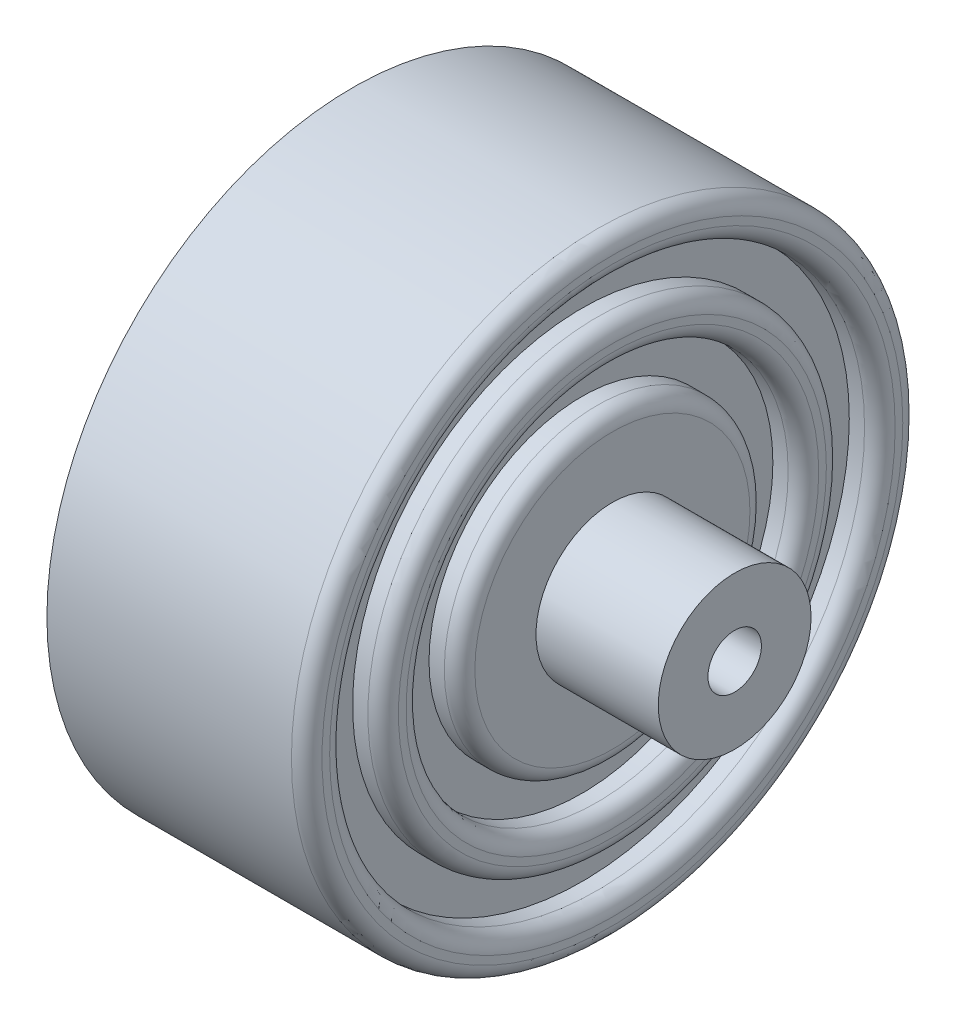
ISO-10303-21;
HEADER;
FILE_DESCRIPTION(('STEP AP214'),'2;1');
FILE_NAME('part.step','',(''),(''),'','','');
FILE_SCHEMA(('AUTOMOTIVE_DESIGN { 1 0 10303 214 1 1 1 1 }'));
ENDSEC;
DATA;
#1=APPLICATION_CONTEXT('core data for automotive mechanical design processes');
#2=APPLICATION_PROTOCOL_DEFINITION('international standard','automotive_design',2000,#1);
#3=PRODUCT_CONTEXT('',#1,'mechanical');
#4=PRODUCT('Part','Part','',(#3));
#5=PRODUCT_RELATED_PRODUCT_CATEGORY('part','',(#4));
#6=PRODUCT_DEFINITION_FORMATION('','',#4);
#7=PRODUCT_DEFINITION_CONTEXT('part definition',#1,'design');
#8=PRODUCT_DEFINITION('design','',#6,#7);
#9=PRODUCT_DEFINITION_SHAPE('','',#8);
#10=(LENGTH_UNIT() NAMED_UNIT(*) SI_UNIT(.MILLI.,.METRE.));
#11=(NAMED_UNIT(*) PLANE_ANGLE_UNIT() SI_UNIT($,.RADIAN.));
#12=(NAMED_UNIT(*) SI_UNIT($,.STERADIAN.) SOLID_ANGLE_UNIT());
#13=UNCERTAINTY_MEASURE_WITH_UNIT(LENGTH_MEASURE(1.E-05),#10,'distance_accuracy_value','');
#14=(GEOMETRIC_REPRESENTATION_CONTEXT(3) GLOBAL_UNCERTAINTY_ASSIGNED_CONTEXT((#13)) GLOBAL_UNIT_ASSIGNED_CONTEXT((#10,
#11,#12)) REPRESENTATION_CONTEXT('',''));
#15=CARTESIAN_POINT('',(0.,0.,0.));
#16=DIRECTION('',(0.,0.,1.));
#17=DIRECTION('',(1.,0.,0.));
#18=AXIS2_PLACEMENT_3D('',#15,#16,#17);
#19=CARTESIAN_POINT('',(17.,0.,0.));
#20=DIRECTION('',(1.,0.,0.));
#21=DIRECTION('',(0.,0.,-1.));
#22=AXIS2_PLACEMENT_3D('',#19,#20,#21);
#23=CYLINDRICAL_SURFACE('',#22,5.);
#24=CARTESIAN_POINT('',(17.,0.,0.));
#25=DIRECTION('',(1.,0.,0.));
#26=DIRECTION('',(0.,0.,-1.));
#27=AXIS2_PLACEMENT_3D('',#24,#25,#26);
#28=CIRCLE('',#27,5.);
#29=CARTESIAN_POINT('',(17.,0.,-5.));
#30=VERTEX_POINT('',#29);
#31=EDGE_CURVE('E263',#30,#30,#28,.T.);
#32=ORIENTED_EDGE('',*,*,#31,.T.);
#33=EDGE_LOOP('',(#32));
#34=FACE_BOUND('',#33,.T.);
#35=CARTESIAN_POINT('',(25.,0.,0.));
#36=DIRECTION('',(1.,0.,0.));
#37=DIRECTION('',(0.,0.,-1.));
#38=AXIS2_PLACEMENT_3D('',#35,#36,#37);
#39=CIRCLE('',#38,5.);
#40=CARTESIAN_POINT('',(25.,0.,-5.));
#41=VERTEX_POINT('',#40);
#42=EDGE_CURVE('E320',#41,#41,#39,.T.);
#43=ORIENTED_EDGE('',*,*,#42,.F.);
#44=EDGE_LOOP('',(#43));
#45=FACE_BOUND('',#44,.T.);
#46=ADVANCED_FACE('F41',(#34,#45),#23,.T.);
#47=CARTESIAN_POINT('',(11.,0.,0.));
#48=DIRECTION('',(1.,0.,0.));
#49=DIRECTION('',(0.,0.,-1.));
#50=AXIS2_PLACEMENT_3D('',#47,#48,#49);
#51=CYLINDRICAL_SURFACE('',#50,1.75);
#52=CARTESIAN_POINT('',(11.,0.,0.));
#53=DIRECTION('',(1.,0.,0.));
#54=DIRECTION('',(0.,0.,-1.));
#55=AXIS2_PLACEMENT_3D('',#52,#53,#54);
#56=CIRCLE('',#55,1.75);
#57=CARTESIAN_POINT('',(11.,0.,-1.75));
#58=VERTEX_POINT('',#57);
#59=EDGE_CURVE('E235',#58,#58,#56,.T.);
#60=ORIENTED_EDGE('',*,*,#59,.F.);
#61=EDGE_LOOP('',(#60));
#62=FACE_BOUND('',#61,.T.);
#63=CARTESIAN_POINT('',(25.,0.,0.));
#64=DIRECTION('',(1.,0.,0.));
#65=DIRECTION('',(0.,0.,-1.));
#66=AXIS2_PLACEMENT_3D('',#63,#64,#65);
#67=CIRCLE('',#66,1.75);
#68=CARTESIAN_POINT('',(25.,0.,-1.75));
#69=VERTEX_POINT('',#68);
#70=EDGE_CURVE('E45',#69,#69,#67,.F.);
#71=ORIENTED_EDGE('',*,*,#70,.F.);
#72=EDGE_LOOP('',(#71));
#73=FACE_BOUND('',#72,.T.);
#74=ADVANCED_FACE('F302',(#62,#73),#51,.F.);
#75=CARTESIAN_POINT('',(16.,0.,0.));
#76=DIRECTION('',(1.,0.,0.));
#77=DIRECTION('',(0.,0.,-1.));
#78=AXIS2_PLACEMENT_3D('',#75,#76,#77);
#79=TOROIDAL_SURFACE('',#78,9.,1.);
#80=CARTESIAN_POINT('',(16.,0.,0.));
#81=DIRECTION('',(1.,0.,0.));
#82=DIRECTION('',(0.,0.,-1.));
#83=AXIS2_PLACEMENT_3D('',#80,#81,#82);
#84=CIRCLE('',#83,10.);
#85=CARTESIAN_POINT('',(16.,0.,-10.));
#86=VERTEX_POINT('',#85);
#87=EDGE_CURVE('E50',#86,#86,#84,.F.);
#88=ORIENTED_EDGE('',*,*,#87,.F.);
#89=EDGE_LOOP('',(#88));
#90=FACE_BOUND('',#89,.T.);
#91=CARTESIAN_POINT('',(17.,0.,0.));
#92=DIRECTION('',(1.,0.,0.));
#93=DIRECTION('',(0.,0.,-1.));
#94=AXIS2_PLACEMENT_3D('',#91,#92,#93);
#95=CIRCLE('',#94,9.);
#96=CARTESIAN_POINT('',(17.,0.,-9.));
#97=VERTEX_POINT('',#96);
#98=EDGE_CURVE('E12',#97,#97,#95,.T.);
#99=ORIENTED_EDGE('',*,*,#98,.F.);
#100=EDGE_LOOP('',(#99));
#101=FACE_BOUND('',#100,.T.);
#102=ADVANCED_FACE('F43',(#90,#101),#79,.T.);
#103=CARTESIAN_POINT('',(16.,0.,0.));
#104=DIRECTION('',(1.,0.,0.));
#105=DIRECTION('',(0.,0.,-1.));
#106=AXIS2_PLACEMENT_3D('',#103,#104,#105);
#107=TOROIDAL_SURFACE('',#106,13.5,1.);
#108=CARTESIAN_POINT('',(16.,0.,0.));
#109=DIRECTION('',(1.,0.,0.));
#110=DIRECTION('',(0.,0.,-1.));
#111=AXIS2_PLACEMENT_3D('',#108,#109,#110);
#112=CIRCLE('',#111,12.5);
#113=CARTESIAN_POINT('',(16.,0.,-12.5));
#114=VERTEX_POINT('',#113);
#115=EDGE_CURVE('E287',#114,#114,#112,.T.);
#116=ORIENTED_EDGE('',*,*,#115,.F.);
#117=EDGE_LOOP('',(#116));
#118=FACE_BOUND('',#117,.T.);
#119=CARTESIAN_POINT('',(17.,0.,0.));
#120=DIRECTION('',(1.,0.,0.));
#121=DIRECTION('',(0.,0.,-1.));
#122=AXIS2_PLACEMENT_3D('',#119,#120,#121);
#123=CIRCLE('',#122,13.5);
#124=CARTESIAN_POINT('',(17.,0.,-13.5));
#125=VERTEX_POINT('',#124);
#126=EDGE_CURVE('E290',#125,#125,#123,.F.);
#127=ORIENTED_EDGE('',*,*,#126,.F.);
#128=EDGE_LOOP('',(#127));
#129=FACE_BOUND('',#128,.T.);
#130=ADVANCED_FACE('F301',(#118,#129),#107,.T.);
#131=CARTESIAN_POINT('',(16.,0.,0.));
#132=DIRECTION('',(1.,0.,0.));
#133=DIRECTION('',(0.,0.,-1.));
#134=AXIS2_PLACEMENT_3D('',#131,#132,#133);
#135=TOROIDAL_SURFACE('',#134,14.,1.);
#136=CARTESIAN_POINT('',(16.,0.,0.));
#137=DIRECTION('',(1.,0.,0.));
#138=DIRECTION('',(0.,0.,-1.));
#139=AXIS2_PLACEMENT_3D('',#136,#137,#138);
#140=CIRCLE('',#139,15.);
#141=CARTESIAN_POINT('',(16.,0.,-15.));
#142=VERTEX_POINT('',#141);
#143=EDGE_CURVE('E281',#142,#142,#140,.F.);
#144=ORIENTED_EDGE('',*,*,#143,.F.);
#145=EDGE_LOOP('',(#144));
#146=FACE_BOUND('',#145,.T.);
#147=CARTESIAN_POINT('',(17.,0.,0.));
#148=DIRECTION('',(1.,0.,0.));
#149=DIRECTION('',(0.,0.,-1.));
#150=AXIS2_PLACEMENT_3D('',#147,#148,#149);
#151=CIRCLE('',#150,14.);
#152=CARTESIAN_POINT('',(17.,0.,-14.));
#153=VERTEX_POINT('',#152);
#154=EDGE_CURVE('E284',#153,#153,#151,.T.);
#155=ORIENTED_EDGE('',*,*,#154,.F.);
#156=EDGE_LOOP('',(#155));
#157=FACE_BOUND('',#156,.T.);
#158=ADVANCED_FACE('F417',(#146,#157),#135,.T.);
#159=CARTESIAN_POINT('',(16.,0.,0.));
#160=DIRECTION('',(1.,0.,0.));
#161=DIRECTION('',(0.,0.,-1.));
#162=AXIS2_PLACEMENT_3D('',#159,#160,#161);
#163=TOROIDAL_SURFACE('',#162,19.,1.);
#164=CARTESIAN_POINT('',(16.,0.,0.));
#165=DIRECTION('',(1.,0.,0.));
#166=DIRECTION('',(0.,0.,-1.));
#167=AXIS2_PLACEMENT_3D('',#164,#165,#166);
#168=CIRCLE('',#167,20.);
#169=CARTESIAN_POINT('',(16.,0.,20.));
#170=VERTEX_POINT('',#169);
#171=EDGE_CURVE('E275',#170,#170,#168,.F.);
#172=ORIENTED_EDGE('',*,*,#171,.F.);
#173=EDGE_LOOP('',(#172));
#174=FACE_BOUND('',#173,.T.);
#175=CARTESIAN_POINT('',(17.,0.,0.));
#176=DIRECTION('',(1.,0.,0.));
#177=DIRECTION('',(0.,0.,-1.));
#178=AXIS2_PLACEMENT_3D('',#175,#176,#177);
#179=CIRCLE('',#178,19.);
#180=CARTESIAN_POINT('',(17.,0.,-19.));
#181=VERTEX_POINT('',#180);
#182=EDGE_CURVE('E278',#181,#181,#179,.T.);
#183=ORIENTED_EDGE('',*,*,#182,.F.);
#184=EDGE_LOOP('',(#183));
#185=FACE_BOUND('',#184,.T.);
#186=ADVANCED_FACE('F413',(#174,#185),#163,.T.);
#187=CARTESIAN_POINT('',(16.,0.,0.));
#188=DIRECTION('',(1.,0.,0.));
#189=DIRECTION('',(0.,0.,-1.));
#190=AXIS2_PLACEMENT_3D('',#187,#188,#189);
#191=TOROIDAL_SURFACE('',#190,18.5,1.);
#192=CARTESIAN_POINT('',(16.,0.,0.));
#193=DIRECTION('',(1.,0.,0.));
#194=DIRECTION('',(0.,0.,-1.));
#195=AXIS2_PLACEMENT_3D('',#192,#193,#194);
#196=CIRCLE('',#195,17.5);
#197=CARTESIAN_POINT('',(16.,0.,-17.5));
#198=VERTEX_POINT('',#197);
#199=EDGE_CURVE('E269',#198,#198,#196,.T.);
#200=ORIENTED_EDGE('',*,*,#199,.F.);
#201=EDGE_LOOP('',(#200));
#202=FACE_BOUND('',#201,.T.);
#203=CARTESIAN_POINT('',(17.,0.,0.));
#204=DIRECTION('',(1.,0.,0.));
#205=DIRECTION('',(0.,0.,-1.));
#206=AXIS2_PLACEMENT_3D('',#203,#204,#205);
#207=CIRCLE('',#206,18.5);
#208=CARTESIAN_POINT('',(17.,0.,-18.5));
#209=VERTEX_POINT('',#208);
#210=EDGE_CURVE('E272',#209,#209,#207,.F.);
#211=ORIENTED_EDGE('',*,*,#210,.F.);
#212=EDGE_LOOP('',(#211));
#213=FACE_BOUND('',#212,.T.);
#214=ADVANCED_FACE('F309',(#202,#213),#191,.T.);
#215=CARTESIAN_POINT('',(17.,0.,0.));
#216=DIRECTION('',(1.,0.,0.));
#217=DIRECTION('',(0.,0.,-1.));
#218=AXIS2_PLACEMENT_3D('',#215,#216,#217);
#219=PLANE('',#218);
#220=ORIENTED_EDGE('',*,*,#98,.T.);
#221=EDGE_LOOP('',(#220));
#222=FACE_BOUND('',#221,.T.);
#223=ORIENTED_EDGE('',*,*,#31,.F.);
#224=EDGE_LOOP('',(#223));
#225=FACE_BOUND('',#224,.T.);
#226=ADVANCED_FACE('F305',(#222,#225),#219,.T.);
#227=CARTESIAN_POINT('',(26.,0.,0.));
#228=DIRECTION('',(-1.,0.,0.));
#229=DIRECTION('',(0.,0.,1.));
#230=AXIS2_PLACEMENT_3D('',#227,#228,#229);
#231=CYLINDRICAL_SURFACE('',#230,20.);
#232=CARTESIAN_POINT('',(0.,0.,0.));
#233=DIRECTION('',(1.,0.,0.));
#234=DIRECTION('',(0.,0.,-1.));
#235=AXIS2_PLACEMENT_3D('',#232,#233,#234);
#236=CIRCLE('',#235,20.);
#237=CARTESIAN_POINT('',(0.,0.,20.));
#238=VERTEX_POINT('',#237);
#239=EDGE_CURVE('E266',#238,#238,#236,.T.);
#240=CARTESIAN_POINT('',(16.,0.,20.));
#241=CARTESIAN_POINT('',(15.8333333333333,0.,20.));
#242=CARTESIAN_POINT('',(15.6666666666667,0.,20.));
#243=CARTESIAN_POINT('',(15.3333333333333,0.,20.));
#244=CARTESIAN_POINT('',(15.1666666666667,0.,20.));
#245=CARTESIAN_POINT('',(14.8333333333333,0.,20.));
#246=CARTESIAN_POINT('',(14.6666666666667,0.,20.));
#247=CARTESIAN_POINT('',(14.3333333333333,0.,20.));
#248=CARTESIAN_POINT('',(14.1666666666667,0.,20.));
#249=CARTESIAN_POINT('',(13.8333333333333,0.,20.));
#250=CARTESIAN_POINT('',(13.6666666666667,0.,20.));
#251=CARTESIAN_POINT('',(13.3333333333333,0.,20.));
#252=CARTESIAN_POINT('',(13.1666666666667,0.,20.));
#253=CARTESIAN_POINT('',(12.8333333333333,0.,20.));
#254=CARTESIAN_POINT('',(12.6666666666667,0.,20.));
#255=CARTESIAN_POINT('',(12.3333333333333,0.,20.));
#256=CARTESIAN_POINT('',(12.1666666666667,0.,20.));
#257=CARTESIAN_POINT('',(11.8333333333333,0.,20.));
#258=CARTESIAN_POINT('',(11.6666666666667,0.,20.));
#259=CARTESIAN_POINT('',(11.3333333333333,0.,20.));
#260=CARTESIAN_POINT('',(11.1666666666667,0.,20.));
#261=CARTESIAN_POINT('',(10.8333333333333,0.,20.));
#262=CARTESIAN_POINT('',(10.6666666666667,0.,20.));
#263=CARTESIAN_POINT('',(10.3333333333333,0.,20.));
#264=CARTESIAN_POINT('',(10.1666666666667,0.,20.));
#265=CARTESIAN_POINT('',(9.83333333333333,0.,20.));
#266=CARTESIAN_POINT('',(9.66666666666667,0.,20.));
#267=CARTESIAN_POINT('',(9.33333333333333,0.,20.));
#268=CARTESIAN_POINT('',(9.16666666666667,0.,20.));
#269=CARTESIAN_POINT('',(8.83333333333333,0.,20.));
#270=CARTESIAN_POINT('',(8.66666666666667,0.,20.));
#271=CARTESIAN_POINT('',(8.33333333333333,0.,20.));
#272=CARTESIAN_POINT('',(8.16666666666667,0.,20.));
#273=CARTESIAN_POINT('',(7.83333333333333,0.,20.));
#274=CARTESIAN_POINT('',(7.66666666666667,0.,20.));
#275=CARTESIAN_POINT('',(7.33333333333333,0.,20.));
#276=CARTESIAN_POINT('',(7.16666666666667,0.,20.));
#277=CARTESIAN_POINT('',(6.83333333333333,0.,20.));
#278=CARTESIAN_POINT('',(6.66666666666667,0.,20.));
#279=CARTESIAN_POINT('',(6.33333333333333,0.,20.));
#280=CARTESIAN_POINT('',(6.16666666666667,0.,20.));
#281=CARTESIAN_POINT('',(5.83333333333333,0.,20.));
#282=CARTESIAN_POINT('',(5.66666666666666,0.,20.));
#283=CARTESIAN_POINT('',(5.33333333333333,0.,20.));
#284=CARTESIAN_POINT('',(5.16666666666667,0.,20.));
#285=CARTESIAN_POINT('',(4.83333333333333,0.,20.));
#286=CARTESIAN_POINT('',(4.66666666666667,0.,20.));
#287=CARTESIAN_POINT('',(4.33333333333333,0.,20.));
#288=CARTESIAN_POINT('',(4.16666666666667,0.,20.));
#289=CARTESIAN_POINT('',(3.83333333333333,0.,20.));
#290=CARTESIAN_POINT('',(3.66666666666667,0.,20.));
#291=CARTESIAN_POINT('',(3.33333333333333,0.,20.));
#292=CARTESIAN_POINT('',(3.16666666666667,0.,20.));
#293=CARTESIAN_POINT('',(2.83333333333333,0.,20.));
#294=CARTESIAN_POINT('',(2.66666666666667,0.,20.));
#295=CARTESIAN_POINT('',(2.33333333333334,0.,20.));
#296=CARTESIAN_POINT('',(2.16666666666667,0.,20.));
#297=CARTESIAN_POINT('',(1.83333333333334,0.,20.));
#298=CARTESIAN_POINT('',(1.66666666666667,0.,20.));
#299=CARTESIAN_POINT('',(1.33333333333333,0.,20.));
#300=CARTESIAN_POINT('',(1.16666666666667,0.,20.));
#301=CARTESIAN_POINT('',(0.833333333333334,0.,20.));
#302=CARTESIAN_POINT('',(0.666666666666667,0.,20.));
#303=CARTESIAN_POINT('',(0.333333333333334,0.,20.));
#304=CARTESIAN_POINT('',(0.166666666666667,0.,20.));
#305=CARTESIAN_POINT('',(0.,0.,20.));
#306=B_SPLINE_CURVE_WITH_KNOTS('',3,(#240,#241,#242,#243,#244,#245,#246,#247,#248,#249,#250,
#251,#252,#253,#254,#255,#256,#257,#258,#259,#260,#261,#262,#263,#264,#265,#266,#267,#268,#269,
#270,#271,#272,#273,#274,#275,#276,#277,#278,#279,#280,#281,#282,#283,#284,#285,#286,#287,#288,
#289,#290,#291,#292,#293,#294,#295,#296,#297,#298,#299,#300,#301,#302,#303,#304,#305),
.UNSPECIFIED.,.F.,.F.,(4,2,2,2,2,2,2,2,2,2,2,2,2,2,2,2,2,2,2,2,2,2,2,2,2,2,2,2,2,2,2,2,4),(0.,
0.500000000000002,1.,1.5,2.,2.5,3.,3.5,4.,4.5,5.,5.5,6.,6.5,7.,7.5,8.,8.5,9.,9.5,10.,10.5,11.,
11.5,12.,12.5,13.,13.5,14.,14.5,15.,15.5,16.),.UNSPECIFIED.);
#307=EDGE_CURVE('BSEAM308',#170,#238,#306,.T.);
#308=ORIENTED_EDGE('',*,*,#171,.T.);
#309=ORIENTED_EDGE('',*,*,#239,.T.);
#310=ORIENTED_EDGE('',*,*,#307,.T.);
#311=ORIENTED_EDGE('',*,*,#307,.F.);
#312=EDGE_LOOP('',(#308,#310,#309,#311));
#313=FACE_BOUND('',#312,.T.);
#314=ADVANCED_FACE('F308',(#313),#231,.T.);
#315=CARTESIAN_POINT('',(0.,0.,0.));
#316=DIRECTION('',(1.,0.,0.));
#317=DIRECTION('',(0.,0.,-1.));
#318=AXIS2_PLACEMENT_3D('',#315,#316,#317);
#319=PLANE('',#318);
#320=DIRECTION('',(0.,-0.366726295490055,0.930328879588364));
#321=VECTOR('',#320,1.);
#322=CARTESIAN_POINT('',(0.,-1.5,-18.));
#323=LINE('',#322,#321);
#324=CARTESIAN_POINT('',(0.,-1.5,-18.));
#325=VERTEX_POINT('',#324);
#326=CARTESIAN_POINT('',(0.,-5.2374013026521,-8.51878087492442));
#327=VERTEX_POINT('',#326);
#328=EDGE_CURVE('E191',#325,#327,#323,.T.);
#329=ORIENTED_EDGE('',*,*,#328,.F.);
#330=CARTESIAN_POINT('',(0.,0.,-18.));
#331=DIRECTION('',(-1.,0.,0.));
#332=DIRECTION('',(0.,0.,1.));
#333=AXIS2_PLACEMENT_3D('',#330,#331,#332);
#334=CIRCLE('',#333,1.5);
#335=CARTESIAN_POINT('',(0.,1.5,-18.));
#336=VERTEX_POINT('',#335);
#337=EDGE_CURVE('E57',#336,#325,#334,.T.);
#338=ORIENTED_EDGE('',*,*,#337,.F.);
#339=DIRECTION('',(0.,-0.366726295490055,-0.930328879588364));
#340=VECTOR('',#339,1.);
#341=CARTESIAN_POINT('',(0.,1.5,-18.));
#342=LINE('',#341,#340);
#343=CARTESIAN_POINT('',(0.,5.23740130265211,-8.51878087492442));
#344=VERTEX_POINT('',#343);
#345=EDGE_CURVE('E231',#344,#336,#342,.T.);
#346=ORIENTED_EDGE('',*,*,#345,.F.);
#347=CARTESIAN_POINT('',(0.,0.,0.));
#348=DIRECTION('',(-1.,0.,0.));
#349=DIRECTION('',(0.,0.,1.));
#350=AXIS2_PLACEMENT_3D('',#347,#348,#349);
#351=CIRCLE('',#350,10.);
#352=CARTESIAN_POINT('',(0.,8.40218228326776,-5.42248401369164));
#353=VERTEX_POINT('',#352);
#354=EDGE_CURVE('E229',#353,#344,#351,.T.);
#355=ORIENTED_EDGE('',*,*,#354,.F.);
#356=DIRECTION('',(0.,-0.925678580015344,-0.378310938912392));
#357=VECTOR('',#356,1.);
#358=CARTESIAN_POINT('',(0.,18.,-1.5));
#359=LINE('',#358,#357);
#360=CARTESIAN_POINT('',(0.,18.,-1.5));
#361=VERTEX_POINT('',#360);
#362=EDGE_CURVE('E165',#361,#353,#359,.T.);
#363=ORIENTED_EDGE('',*,*,#362,.F.);
#364=CARTESIAN_POINT('',(0.,18.,0.));
#365=DIRECTION('',(-1.,0.,0.));
#366=DIRECTION('',(0.,0.,1.));
#367=AXIS2_PLACEMENT_3D('',#364,#365,#366);
#368=CIRCLE('',#367,1.5);
#369=CARTESIAN_POINT('',(0.,18.,1.5));
#370=VERTEX_POINT('',#369);
#371=EDGE_CURVE('E225',#370,#361,#368,.T.);
#372=ORIENTED_EDGE('',*,*,#371,.F.);
#373=DIRECTION('',(0.,0.925678580015344,-0.378310938912392));
#374=VECTOR('',#373,1.);
#375=CARTESIAN_POINT('',(0.,18.,1.5));
#376=LINE('',#375,#374);
#377=CARTESIAN_POINT('',(0.,8.40218228326776,5.42248401369164));
#378=VERTEX_POINT('',#377);
#379=EDGE_CURVE('E222',#378,#370,#376,.T.);
#380=ORIENTED_EDGE('',*,*,#379,.F.);
#381=CARTESIAN_POINT('',(0.,0.,0.));
#382=DIRECTION('',(-1.,0.,0.));
#383=DIRECTION('',(0.,0.,1.));
#384=AXIS2_PLACEMENT_3D('',#381,#382,#383);
#385=CIRCLE('',#384,10.);
#386=CARTESIAN_POINT('',(0.,5.23740130265211,8.51878087492442));
#387=VERTEX_POINT('',#386);
#388=EDGE_CURVE('E219',#387,#378,#385,.T.);
#389=ORIENTED_EDGE('',*,*,#388,.F.);
#390=DIRECTION('',(0.,0.366726295490055,-0.930328879588364));
#391=VECTOR('',#390,1.);
#392=CARTESIAN_POINT('',(0.,1.5,18.));
#393=LINE('',#392,#391);
#394=CARTESIAN_POINT('',(0.,1.5,18.));
#395=VERTEX_POINT('',#394);
#396=EDGE_CURVE('E216',#395,#387,#393,.T.);
#397=ORIENTED_EDGE('',*,*,#396,.F.);
#398=CARTESIAN_POINT('',(0.,0.,18.));
#399=DIRECTION('',(-1.,0.,0.));
#400=DIRECTION('',(0.,0.,1.));
#401=AXIS2_PLACEMENT_3D('',#398,#399,#400);
#402=CIRCLE('',#401,1.5);
#403=CARTESIAN_POINT('',(0.,-1.5,18.));
#404=VERTEX_POINT('',#403);
#405=EDGE_CURVE('E213',#404,#395,#402,.T.);
#406=ORIENTED_EDGE('',*,*,#405,.F.);
#407=DIRECTION('',(0.,0.366726295490055,0.930328879588364));
#408=VECTOR('',#407,1.);
#409=CARTESIAN_POINT('',(0.,-1.5,18.));
#410=LINE('',#409,#408);
#411=CARTESIAN_POINT('',(0.,-5.23740130265211,8.51878087492442));
#412=VERTEX_POINT('',#411);
#413=EDGE_CURVE('E210',#412,#404,#410,.T.);
#414=ORIENTED_EDGE('',*,*,#413,.F.);
#415=CARTESIAN_POINT('',(0.,0.,0.));
#416=DIRECTION('',(-1.,0.,0.));
#417=DIRECTION('',(0.,0.,1.));
#418=AXIS2_PLACEMENT_3D('',#415,#416,#417);
#419=CIRCLE('',#418,10.);
#420=CARTESIAN_POINT('',(0.,-8.40218228326776,5.42248401369164));
#421=VERTEX_POINT('',#420);
#422=EDGE_CURVE('E207',#421,#412,#419,.T.);
#423=ORIENTED_EDGE('',*,*,#422,.F.);
#424=DIRECTION('',(0.,0.925678580015344,0.378310938912392));
#425=VECTOR('',#424,1.);
#426=CARTESIAN_POINT('',(0.,-18.,1.5));
#427=LINE('',#426,#425);
#428=CARTESIAN_POINT('',(0.,-18.,1.5));
#429=VERTEX_POINT('',#428);
#430=EDGE_CURVE('E204',#429,#421,#427,.T.);
#431=ORIENTED_EDGE('',*,*,#430,.F.);
#432=CARTESIAN_POINT('',(0.,-18.,0.));
#433=DIRECTION('',(-1.,0.,0.));
#434=DIRECTION('',(0.,0.,1.));
#435=AXIS2_PLACEMENT_3D('',#432,#433,#434);
#436=CIRCLE('',#435,1.5);
#437=CARTESIAN_POINT('',(0.,-18.,-1.5));
#438=VERTEX_POINT('',#437);
#439=EDGE_CURVE('E201',#438,#429,#436,.T.);
#440=ORIENTED_EDGE('',*,*,#439,.F.);
#441=DIRECTION('',(0.,-0.925678580015344,0.378310938912392));
#442=VECTOR('',#441,1.);
#443=CARTESIAN_POINT('',(0.,-18.,-1.5));
#444=LINE('',#443,#442);
#445=CARTESIAN_POINT('',(0.,-8.40218228326776,-5.42248401369164));
#446=VERTEX_POINT('',#445);
#447=EDGE_CURVE('E198',#446,#438,#444,.T.);
#448=ORIENTED_EDGE('',*,*,#447,.F.);
#449=CARTESIAN_POINT('',(0.,0.,0.));
#450=DIRECTION('',(-1.,0.,0.));
#451=DIRECTION('',(0.,0.,1.));
#452=AXIS2_PLACEMENT_3D('',#449,#450,#451);
#453=CIRCLE('',#452,10.);
#454=EDGE_CURVE('E195',#327,#446,#453,.T.);
#455=ORIENTED_EDGE('',*,*,#454,.F.);
#456=EDGE_LOOP('',(#329,#338,#346,#355,#363,#372,#380,#389,#397,#406,#414,#423,#431,#440,#448,#455));
#457=FACE_BOUND('',#456,.T.);
#458=ORIENTED_EDGE('',*,*,#239,.F.);
#459=EDGE_LOOP('',(#458));
#460=FACE_BOUND('',#459,.T.);
#461=ADVANCED_FACE('F382',(#457,#460),#319,.F.);
#462=ORIENTED_EDGE('',*,*,#182,.T.);
#463=EDGE_LOOP('',(#462));
#464=FACE_BOUND('',#463,.T.);
#465=ORIENTED_EDGE('',*,*,#210,.T.);
#466=EDGE_LOOP('',(#465));
#467=FACE_BOUND('',#466,.T.);
#468=ADVANCED_FACE('F312',(#464,#467),#219,.T.);
#469=CARTESIAN_POINT('',(11.,0.,0.));
#470=DIRECTION('',(1.,0.,0.));
#471=DIRECTION('',(0.,0.,-1.));
#472=AXIS2_PLACEMENT_3D('',#469,#470,#471);
#473=PLANE('',#472);
#474=CARTESIAN_POINT('',(11.,0.,0.));
#475=DIRECTION('',(1.,0.,0.));
#476=DIRECTION('',(0.,0.,-1.));
#477=AXIS2_PLACEMENT_3D('',#474,#475,#476);
#478=CIRCLE('',#477,1.5);
#479=CARTESIAN_POINT('',(11.,0.,-1.5));
#480=VERTEX_POINT('',#479);
#481=EDGE_CURVE('E192',#480,#480,#478,.T.);
#482=ORIENTED_EDGE('',*,*,#481,.F.);
#483=EDGE_LOOP('',(#482));
#484=FACE_BOUND('',#483,.T.);
#485=ORIENTED_EDGE('',*,*,#59,.T.);
#486=EDGE_LOOP('',(#485));
#487=FACE_BOUND('',#486,.T.);
#488=ADVANCED_FACE('F388',(#484,#487),#473,.T.);
#489=CARTESIAN_POINT('',(2.,0.,-18.));
#490=DIRECTION('',(-1.,0.,0.));
#491=DIRECTION('',(0.,0.,1.));
#492=AXIS2_PLACEMENT_3D('',#489,#490,#491);
#493=CYLINDRICAL_SURFACE('',#492,1.5);
#494=ORIENTED_EDGE('',*,*,#337,.T.);
#495=DIRECTION('',(-1.,0.,0.));
#496=VECTOR('',#495,1.);
#497=CARTESIAN_POINT('',(2.,-1.5,-18.));
#498=LINE('',#497,#496);
#499=CARTESIAN_POINT('',(2.,-1.5,-18.));
#500=VERTEX_POINT('',#499);
#501=EDGE_CURVE('E117',#500,#325,#498,.T.);
#502=ORIENTED_EDGE('',*,*,#501,.F.);
#503=CARTESIAN_POINT('',(2.,0.,-18.));
#504=DIRECTION('',(-1.,0.,0.));
#505=DIRECTION('',(0.,0.,1.));
#506=AXIS2_PLACEMENT_3D('',#503,#504,#505);
#507=CIRCLE('',#506,1.5);
#508=CARTESIAN_POINT('',(2.,1.5,-18.));
#509=VERTEX_POINT('',#508);
#510=EDGE_CURVE('E233',#509,#500,#507,.T.);
#511=ORIENTED_EDGE('',*,*,#510,.F.);
#512=DIRECTION('',(-1.,0.,0.));
#513=VECTOR('',#512,1.);
#514=CARTESIAN_POINT('',(2.,1.5,-18.));
#515=LINE('',#514,#513);
#516=EDGE_CURVE('E65',#509,#336,#515,.T.);
#517=ORIENTED_EDGE('',*,*,#516,.T.);
#518=EDGE_LOOP('',(#494,#502,#511,#517));
#519=FACE_BOUND('',#518,.T.);
#520=ADVANCED_FACE('F386',(#519),#493,.F.);
#521=CARTESIAN_POINT('',(2.,1.5,-18.));
#522=DIRECTION('',(0.,0.930328879588364,-0.366726295490055));
#523=DIRECTION('',(0.,0.366726295490055,0.930328879588364));
#524=AXIS2_PLACEMENT_3D('',#521,#522,#523);
#525=PLANE('',#524);
#526=ORIENTED_EDGE('',*,*,#345,.T.);
#527=ORIENTED_EDGE('',*,*,#516,.F.);
#528=DIRECTION('',(0.,-0.366726295490055,-0.930328879588364));
#529=VECTOR('',#528,1.);
#530=CARTESIAN_POINT('',(2.,1.5,-18.));
#531=LINE('',#530,#529);
#532=CARTESIAN_POINT('',(2.,5.23740130265211,-8.51878087492442));
#533=VERTEX_POINT('',#532);
#534=EDGE_CURVE('E177',#533,#509,#531,.T.);
#535=ORIENTED_EDGE('',*,*,#534,.F.);
#536=DIRECTION('',(-1.,0.,0.));
#537=VECTOR('',#536,1.);
#538=CARTESIAN_POINT('',(2.,5.23740130265211,-8.51878087492442));
#539=LINE('',#538,#537);
#540=EDGE_CURVE('E169',#533,#344,#539,.T.);
#541=ORIENTED_EDGE('',*,*,#540,.T.);
#542=EDGE_LOOP('',(#526,#527,#535,#541));
#543=FACE_BOUND('',#542,.T.);
#544=ADVANCED_FACE('F385',(#543),#525,.F.);
#545=CARTESIAN_POINT('',(2.,0.,0.));
#546=DIRECTION('',(-1.,0.,0.));
#547=DIRECTION('',(0.,0.,1.));
#548=AXIS2_PLACEMENT_3D('',#545,#546,#547);
#549=CYLINDRICAL_SURFACE('',#548,10.);
#550=ORIENTED_EDGE('',*,*,#354,.T.);
#551=ORIENTED_EDGE('',*,*,#540,.F.);
#552=CARTESIAN_POINT('',(2.,0.,0.));
#553=DIRECTION('',(-1.,0.,0.));
#554=DIRECTION('',(0.,0.,1.));
#555=AXIS2_PLACEMENT_3D('',#552,#553,#554);
#556=CIRCLE('',#555,10.);
#557=CARTESIAN_POINT('',(2.,8.40218228326776,-5.42248401369164));
#558=VERTEX_POINT('',#557);
#559=EDGE_CURVE('E173',#558,#533,#556,.T.);
#560=ORIENTED_EDGE('',*,*,#559,.F.);
#561=DIRECTION('',(-1.,0.,0.));
#562=VECTOR('',#561,1.);
#563=CARTESIAN_POINT('',(2.,8.40218228326776,-5.42248401369164));
#564=LINE('',#563,#562);
#565=EDGE_CURVE('E158',#558,#353,#564,.T.);
#566=ORIENTED_EDGE('',*,*,#565,.T.);
#567=EDGE_LOOP('',(#550,#551,#560,#566));
#568=FACE_BOUND('',#567,.T.);
#569=ADVANCED_FACE('F174',(#568),#549,.F.);
#570=CARTESIAN_POINT('',(2.,18.,-1.5));
#571=DIRECTION('',(0.,0.378310938912392,-0.925678580015344));
#572=DIRECTION('',(0.,0.925678580015345,0.378310938912392));
#573=AXIS2_PLACEMENT_3D('',#570,#571,#572);
#574=PLANE('',#573);
#575=ORIENTED_EDGE('',*,*,#362,.T.);
#576=ORIENTED_EDGE('',*,*,#565,.F.);
#577=DIRECTION('',(0.,-0.925678580015344,-0.378310938912392));
#578=VECTOR('',#577,1.);
#579=CARTESIAN_POINT('',(2.,18.,-1.5));
#580=LINE('',#579,#578);
#581=CARTESIAN_POINT('',(2.,18.,-1.5));
#582=VERTEX_POINT('',#581);
#583=EDGE_CURVE('E162',#582,#558,#580,.T.);
#584=ORIENTED_EDGE('',*,*,#583,.F.);
#585=DIRECTION('',(-1.,0.,0.));
#586=VECTOR('',#585,1.);
#587=CARTESIAN_POINT('',(2.,18.,-1.5));
#588=LINE('',#587,#586);
#589=EDGE_CURVE('E170',#582,#361,#588,.T.);
#590=ORIENTED_EDGE('',*,*,#589,.T.);
#591=EDGE_LOOP('',(#575,#576,#584,#590));
#592=FACE_BOUND('',#591,.T.);
#593=ADVANCED_FACE('F160',(#592),#574,.F.);
#594=CARTESIAN_POINT('',(2.,18.,0.));
#595=DIRECTION('',(-1.,0.,0.));
#596=DIRECTION('',(0.,0.,1.));
#597=AXIS2_PLACEMENT_3D('',#594,#595,#596);
#598=CYLINDRICAL_SURFACE('',#597,1.5);
#599=ORIENTED_EDGE('',*,*,#371,.T.);
#600=ORIENTED_EDGE('',*,*,#589,.F.);
#601=CARTESIAN_POINT('',(2.,18.,0.));
#602=DIRECTION('',(-1.,0.,0.));
#603=DIRECTION('',(0.,0.,1.));
#604=AXIS2_PLACEMENT_3D('',#601,#602,#603);
#605=CIRCLE('',#604,1.5);
#606=CARTESIAN_POINT('',(2.,18.,1.5));
#607=VERTEX_POINT('',#606);
#608=EDGE_CURVE('E183',#607,#582,#605,.T.);
#609=ORIENTED_EDGE('',*,*,#608,.F.);
#610=DIRECTION('',(-1.,0.,0.));
#611=VECTOR('',#610,1.);
#612=CARTESIAN_POINT('',(2.,18.,1.5));
#613=LINE('',#612,#611);
#614=EDGE_CURVE('E238',#607,#370,#613,.T.);
#615=ORIENTED_EDGE('',*,*,#614,.T.);
#616=EDGE_LOOP('',(#599,#600,#609,#615));
#617=FACE_BOUND('',#616,.T.);
#618=ADVANCED_FACE('F379',(#617),#598,.F.);
#619=CARTESIAN_POINT('',(2.,18.,1.5));
#620=DIRECTION('',(0.,0.378310938912392,0.925678580015344));
#621=DIRECTION('',(0.,-0.925678580015345,0.378310938912392));
#622=AXIS2_PLACEMENT_3D('',#619,#620,#621);
#623=PLANE('',#622);
#624=ORIENTED_EDGE('',*,*,#379,.T.);
#625=ORIENTED_EDGE('',*,*,#614,.F.);
#626=DIRECTION('',(0.,0.925678580015344,-0.378310938912392));
#627=VECTOR('',#626,1.);
#628=CARTESIAN_POINT('',(2.,18.,1.5));
#629=LINE('',#628,#627);
#630=CARTESIAN_POINT('',(2.,8.40218228326776,5.42248401369164));
#631=VERTEX_POINT('',#630);
#632=EDGE_CURVE('E185',#631,#607,#629,.T.);
#633=ORIENTED_EDGE('',*,*,#632,.F.);
#634=DIRECTION('',(-1.,0.,0.));
#635=VECTOR('',#634,1.);
#636=CARTESIAN_POINT('',(2.,8.40218228326776,5.42248401369164));
#637=LINE('',#636,#635);
#638=EDGE_CURVE('E240',#631,#378,#637,.T.);
#639=ORIENTED_EDGE('',*,*,#638,.T.);
#640=EDGE_LOOP('',(#624,#625,#633,#639));
#641=FACE_BOUND('',#640,.T.);
#642=ADVANCED_FACE('F375',(#641),#623,.F.);
#643=CARTESIAN_POINT('',(2.,0.,0.));
#644=DIRECTION('',(-1.,0.,0.));
#645=DIRECTION('',(0.,0.,1.));
#646=AXIS2_PLACEMENT_3D('',#643,#644,#645);
#647=CYLINDRICAL_SURFACE('',#646,10.);
#648=ORIENTED_EDGE('',*,*,#388,.T.);
#649=ORIENTED_EDGE('',*,*,#638,.F.);
#650=CARTESIAN_POINT('',(2.,0.,0.));
#651=DIRECTION('',(-1.,0.,0.));
#652=DIRECTION('',(0.,0.,1.));
#653=AXIS2_PLACEMENT_3D('',#650,#651,#652);
#654=CIRCLE('',#653,10.);
#655=CARTESIAN_POINT('',(2.,5.23740130265211,8.51878087492442));
#656=VERTEX_POINT('',#655);
#657=EDGE_CURVE('E370',#656,#631,#654,.T.);
#658=ORIENTED_EDGE('',*,*,#657,.F.);
#659=DIRECTION('',(-1.,0.,0.));
#660=VECTOR('',#659,1.);
#661=CARTESIAN_POINT('',(2.,5.23740130265211,8.51878087492442));
#662=LINE('',#661,#660);
#663=EDGE_CURVE('E242',#656,#387,#662,.T.);
#664=ORIENTED_EDGE('',*,*,#663,.T.);
#665=EDGE_LOOP('',(#648,#649,#658,#664));
#666=FACE_BOUND('',#665,.T.);
#667=ADVANCED_FACE('F471',(#666),#647,.F.);
#668=CARTESIAN_POINT('',(2.,1.5,18.));
#669=DIRECTION('',(0.,0.930328879588364,0.366726295490055));
#670=DIRECTION('',(0.,-0.366726295490055,0.930328879588364));
#671=AXIS2_PLACEMENT_3D('',#668,#669,#670);
#672=PLANE('',#671);
#673=ORIENTED_EDGE('',*,*,#396,.T.);
#674=ORIENTED_EDGE('',*,*,#663,.F.);
#675=DIRECTION('',(0.,0.366726295490055,-0.930328879588364));
#676=VECTOR('',#675,1.);
#677=CARTESIAN_POINT('',(2.,1.5,18.));
#678=LINE('',#677,#676);
#679=CARTESIAN_POINT('',(2.,1.5,18.));
#680=VERTEX_POINT('',#679);
#681=EDGE_CURVE('E367',#680,#656,#678,.T.);
#682=ORIENTED_EDGE('',*,*,#681,.F.);
#683=DIRECTION('',(-1.,0.,0.));
#684=VECTOR('',#683,1.);
#685=CARTESIAN_POINT('',(2.,1.5,18.));
#686=LINE('',#685,#684);
#687=EDGE_CURVE('E244',#680,#395,#686,.T.);
#688=ORIENTED_EDGE('',*,*,#687,.T.);
#689=EDGE_LOOP('',(#673,#674,#682,#688));
#690=FACE_BOUND('',#689,.T.);
#691=ADVANCED_FACE('F474',(#690),#672,.F.);
#692=CARTESIAN_POINT('',(2.,0.,18.));
#693=DIRECTION('',(-1.,0.,0.));
#694=DIRECTION('',(0.,0.,1.));
#695=AXIS2_PLACEMENT_3D('',#692,#693,#694);
#696=CYLINDRICAL_SURFACE('',#695,1.5);
#697=ORIENTED_EDGE('',*,*,#405,.T.);
#698=ORIENTED_EDGE('',*,*,#687,.F.);
#699=CARTESIAN_POINT('',(2.,0.,18.));
#700=DIRECTION('',(-1.,0.,0.));
#701=DIRECTION('',(0.,0.,1.));
#702=AXIS2_PLACEMENT_3D('',#699,#700,#701);
#703=CIRCLE('',#702,1.5);
#704=CARTESIAN_POINT('',(2.,-1.5,18.));
#705=VERTEX_POINT('',#704);
#706=EDGE_CURVE('E364',#705,#680,#703,.T.);
#707=ORIENTED_EDGE('',*,*,#706,.F.);
#708=DIRECTION('',(-1.,0.,0.));
#709=VECTOR('',#708,1.);
#710=CARTESIAN_POINT('',(2.,-1.5,18.));
#711=LINE('',#710,#709);
#712=EDGE_CURVE('E246',#705,#404,#711,.T.);
#713=ORIENTED_EDGE('',*,*,#712,.T.);
#714=EDGE_LOOP('',(#697,#698,#707,#713));
#715=FACE_BOUND('',#714,.T.);
#716=ADVANCED_FACE('F478',(#715),#696,.F.);
#717=CARTESIAN_POINT('',(2.,-1.5,18.));
#718=DIRECTION('',(0.,-0.930328879588364,0.366726295490055));
#719=DIRECTION('',(0.,-0.366726295490055,-0.930328879588364));
#720=AXIS2_PLACEMENT_3D('',#717,#718,#719);
#721=PLANE('',#720);
#722=ORIENTED_EDGE('',*,*,#413,.T.);
#723=ORIENTED_EDGE('',*,*,#712,.F.);
#724=DIRECTION('',(0.,0.366726295490055,0.930328879588364));
#725=VECTOR('',#724,1.);
#726=CARTESIAN_POINT('',(2.,-1.5,18.));
#727=LINE('',#726,#725);
#728=CARTESIAN_POINT('',(2.,-5.23740130265211,8.51878087492442));
#729=VERTEX_POINT('',#728);
#730=EDGE_CURVE('E361',#729,#705,#727,.T.);
#731=ORIENTED_EDGE('',*,*,#730,.F.);
#732=DIRECTION('',(-1.,0.,0.));
#733=VECTOR('',#732,1.);
#734=CARTESIAN_POINT('',(2.,-5.23740130265211,8.51878087492442));
#735=LINE('',#734,#733);
#736=EDGE_CURVE('E248',#729,#412,#735,.T.);
#737=ORIENTED_EDGE('',*,*,#736,.T.);
#738=EDGE_LOOP('',(#722,#723,#731,#737));
#739=FACE_BOUND('',#738,.T.);
#740=ADVANCED_FACE('F482',(#739),#721,.F.);
#741=CARTESIAN_POINT('',(2.,0.,0.));
#742=DIRECTION('',(-1.,0.,0.));
#743=DIRECTION('',(0.,0.,1.));
#744=AXIS2_PLACEMENT_3D('',#741,#742,#743);
#745=CYLINDRICAL_SURFACE('',#744,10.);
#746=ORIENTED_EDGE('',*,*,#422,.T.);
#747=ORIENTED_EDGE('',*,*,#736,.F.);
#748=CARTESIAN_POINT('',(2.,0.,0.));
#749=DIRECTION('',(-1.,0.,0.));
#750=DIRECTION('',(0.,0.,1.));
#751=AXIS2_PLACEMENT_3D('',#748,#749,#750);
#752=CIRCLE('',#751,10.);
#753=CARTESIAN_POINT('',(2.,-8.40218228326776,5.42248401369164));
#754=VERTEX_POINT('',#753);
#755=EDGE_CURVE('E358',#754,#729,#752,.T.);
#756=ORIENTED_EDGE('',*,*,#755,.F.);
#757=DIRECTION('',(-1.,0.,0.));
#758=VECTOR('',#757,1.);
#759=CARTESIAN_POINT('',(2.,-8.40218228326776,5.42248401369164));
#760=LINE('',#759,#758);
#761=EDGE_CURVE('E250',#754,#421,#760,.T.);
#762=ORIENTED_EDGE('',*,*,#761,.T.);
#763=EDGE_LOOP('',(#746,#747,#756,#762));
#764=FACE_BOUND('',#763,.T.);
#765=ADVANCED_FACE('F486',(#764),#745,.F.);
#766=CARTESIAN_POINT('',(2.,-18.,1.5));
#767=DIRECTION('',(0.,-0.378310938912392,0.925678580015344));
#768=DIRECTION('',(0.,-0.925678580015345,-0.378310938912392));
#769=AXIS2_PLACEMENT_3D('',#766,#767,#768);
#770=PLANE('',#769);
#771=ORIENTED_EDGE('',*,*,#430,.T.);
#772=ORIENTED_EDGE('',*,*,#761,.F.);
#773=DIRECTION('',(0.,0.925678580015344,0.378310938912392));
#774=VECTOR('',#773,1.);
#775=CARTESIAN_POINT('',(2.,-18.,1.5));
#776=LINE('',#775,#774);
#777=CARTESIAN_POINT('',(2.,-18.,1.5));
#778=VERTEX_POINT('',#777);
#779=EDGE_CURVE('E355',#778,#754,#776,.T.);
#780=ORIENTED_EDGE('',*,*,#779,.F.);
#781=DIRECTION('',(-1.,0.,0.));
#782=VECTOR('',#781,1.);
#783=CARTESIAN_POINT('',(2.,-18.,1.5));
#784=LINE('',#783,#782);
#785=EDGE_CURVE('E252',#778,#429,#784,.T.);
#786=ORIENTED_EDGE('',*,*,#785,.T.);
#787=EDGE_LOOP('',(#771,#772,#780,#786));
#788=FACE_BOUND('',#787,.T.);
#789=ADVANCED_FACE('F490',(#788),#770,.F.);
#790=CARTESIAN_POINT('',(2.,-18.,0.));
#791=DIRECTION('',(-1.,0.,0.));
#792=DIRECTION('',(0.,0.,1.));
#793=AXIS2_PLACEMENT_3D('',#790,#791,#792);
#794=CYLINDRICAL_SURFACE('',#793,1.5);
#795=ORIENTED_EDGE('',*,*,#439,.T.);
#796=ORIENTED_EDGE('',*,*,#785,.F.);
#797=CARTESIAN_POINT('',(2.,-18.,0.));
#798=DIRECTION('',(-1.,0.,0.));
#799=DIRECTION('',(0.,0.,1.));
#800=AXIS2_PLACEMENT_3D('',#797,#798,#799);
#801=CIRCLE('',#800,1.5);
#802=CARTESIAN_POINT('',(2.,-18.,-1.5));
#803=VERTEX_POINT('',#802);
#804=EDGE_CURVE('E352',#803,#778,#801,.T.);
#805=ORIENTED_EDGE('',*,*,#804,.F.);
#806=DIRECTION('',(-1.,0.,0.));
#807=VECTOR('',#806,1.);
#808=CARTESIAN_POINT('',(2.,-18.,-1.5));
#809=LINE('',#808,#807);
#810=EDGE_CURVE('E254',#803,#438,#809,.T.);
#811=ORIENTED_EDGE('',*,*,#810,.T.);
#812=EDGE_LOOP('',(#795,#796,#805,#811));
#813=FACE_BOUND('',#812,.T.);
#814=ADVANCED_FACE('F494',(#813),#794,.F.);
#815=CARTESIAN_POINT('',(2.,-18.,-1.5));
#816=DIRECTION('',(0.,-0.378310938912392,-0.925678580015344));
#817=DIRECTION('',(0.,0.925678580015345,-0.378310938912392));
#818=AXIS2_PLACEMENT_3D('',#815,#816,#817);
#819=PLANE('',#818);
#820=ORIENTED_EDGE('',*,*,#447,.T.);
#821=ORIENTED_EDGE('',*,*,#810,.F.);
#822=DIRECTION('',(0.,-0.925678580015344,0.378310938912392));
#823=VECTOR('',#822,1.);
#824=CARTESIAN_POINT('',(2.,-18.,-1.5));
#825=LINE('',#824,#823);
#826=CARTESIAN_POINT('',(2.,-8.40218228326776,-5.42248401369164));
#827=VERTEX_POINT('',#826);
#828=EDGE_CURVE('E349',#827,#803,#825,.T.);
#829=ORIENTED_EDGE('',*,*,#828,.F.);
#830=DIRECTION('',(-1.,0.,0.));
#831=VECTOR('',#830,1.);
#832=CARTESIAN_POINT('',(2.,-8.40218228326776,-5.42248401369164));
#833=LINE('',#832,#831);
#834=EDGE_CURVE('E256',#827,#446,#833,.T.);
#835=ORIENTED_EDGE('',*,*,#834,.T.);
#836=EDGE_LOOP('',(#820,#821,#829,#835));
#837=FACE_BOUND('',#836,.T.);
#838=ADVANCED_FACE('F498',(#837),#819,.F.);
#839=CARTESIAN_POINT('',(2.,0.,0.));
#840=DIRECTION('',(-1.,0.,0.));
#841=DIRECTION('',(0.,0.,1.));
#842=AXIS2_PLACEMENT_3D('',#839,#840,#841);
#843=CYLINDRICAL_SURFACE('',#842,10.);
#844=ORIENTED_EDGE('',*,*,#454,.T.);
#845=ORIENTED_EDGE('',*,*,#834,.F.);
#846=CARTESIAN_POINT('',(2.,0.,0.));
#847=DIRECTION('',(-1.,0.,0.));
#848=DIRECTION('',(0.,0.,1.));
#849=AXIS2_PLACEMENT_3D('',#846,#847,#848);
#850=CIRCLE('',#849,10.);
#851=CARTESIAN_POINT('',(2.,-5.2374013026521,-8.51878087492442));
#852=VERTEX_POINT('',#851);
#853=EDGE_CURVE('E346',#852,#827,#850,.T.);
#854=ORIENTED_EDGE('',*,*,#853,.F.);
#855=DIRECTION('',(-1.,0.,0.));
#856=VECTOR('',#855,1.);
#857=CARTESIAN_POINT('',(2.,-5.2374013026521,-8.51878087492442));
#858=LINE('',#857,#856);
#859=EDGE_CURVE('E258',#852,#327,#858,.T.);
#860=ORIENTED_EDGE('',*,*,#859,.T.);
#861=EDGE_LOOP('',(#844,#845,#854,#860));
#862=FACE_BOUND('',#861,.T.);
#863=ADVANCED_FACE('F501',(#862),#843,.F.);
#864=CARTESIAN_POINT('',(2.,-1.5,-18.));
#865=DIRECTION('',(0.,-0.930328879588364,-0.366726295490055));
#866=DIRECTION('',(0.,0.366726295490055,-0.930328879588364));
#867=AXIS2_PLACEMENT_3D('',#864,#865,#866);
#868=PLANE('',#867);
#869=ORIENTED_EDGE('',*,*,#328,.T.);
#870=ORIENTED_EDGE('',*,*,#859,.F.);
#871=DIRECTION('',(0.,-0.366726295490055,0.930328879588364));
#872=VECTOR('',#871,1.);
#873=CARTESIAN_POINT('',(2.,-1.5,-18.));
#874=LINE('',#873,#872);
#875=EDGE_CURVE('E343',#500,#852,#874,.T.);
#876=ORIENTED_EDGE('',*,*,#875,.F.);
#877=ORIENTED_EDGE('',*,*,#501,.T.);
#878=EDGE_LOOP('',(#869,#870,#876,#877));
#879=FACE_BOUND('',#878,.T.);
#880=ADVANCED_FACE('F398',(#879),#868,.F.);
#881=CARTESIAN_POINT('',(2.,0.,-18.));
#882=DIRECTION('',(-1.,0.,0.));
#883=DIRECTION('',(0.,0.,1.));
#884=AXIS2_PLACEMENT_3D('',#881,#882,#883);
#885=PLANE('',#884);
#886=CARTESIAN_POINT('',(2.,0.,0.));
#887=DIRECTION('',(-1.,0.,0.));
#888=DIRECTION('',(0.,0.,1.));
#889=AXIS2_PLACEMENT_3D('',#886,#887,#888);
#890=CIRCLE('',#889,1.5);
#891=CARTESIAN_POINT('',(2.,0.,1.5));
#892=VERTEX_POINT('',#891);
#893=EDGE_CURVE('E337',#892,#892,#890,.T.);
#894=ORIENTED_EDGE('',*,*,#893,.F.);
#895=EDGE_LOOP('',(#894));
#896=FACE_BOUND('',#895,.T.);
#897=ORIENTED_EDGE('',*,*,#510,.T.);
#898=ORIENTED_EDGE('',*,*,#875,.T.);
#899=ORIENTED_EDGE('',*,*,#853,.T.);
#900=ORIENTED_EDGE('',*,*,#828,.T.);
#901=ORIENTED_EDGE('',*,*,#804,.T.);
#902=ORIENTED_EDGE('',*,*,#779,.T.);
#903=ORIENTED_EDGE('',*,*,#755,.T.);
#904=ORIENTED_EDGE('',*,*,#730,.T.);
#905=ORIENTED_EDGE('',*,*,#706,.T.);
#906=ORIENTED_EDGE('',*,*,#681,.T.);
#907=ORIENTED_EDGE('',*,*,#657,.T.);
#908=ORIENTED_EDGE('',*,*,#632,.T.);
#909=ORIENTED_EDGE('',*,*,#608,.T.);
#910=ORIENTED_EDGE('',*,*,#583,.T.);
#911=ORIENTED_EDGE('',*,*,#559,.T.);
#912=ORIENTED_EDGE('',*,*,#534,.T.);
#913=EDGE_LOOP('',(#897,#898,#899,#900,#901,#902,#903,#904,#905,#906,#907,#908,#909,#910,#911,#912));
#914=FACE_BOUND('',#913,.T.);
#915=ADVANCED_FACE('F180',(#896,#914),#885,.T.);
#916=CARTESIAN_POINT('',(26.,0.,0.));
#917=DIRECTION('',(-1.,0.,0.));
#918=DIRECTION('',(0.,0.,1.));
#919=AXIS2_PLACEMENT_3D('',#916,#917,#918);
#920=CYLINDRICAL_SURFACE('',#919,1.5);
#921=ORIENTED_EDGE('',*,*,#481,.T.);
#922=EDGE_LOOP('',(#921));
#923=FACE_BOUND('',#922,.T.);
#924=ORIENTED_EDGE('',*,*,#893,.T.);
#925=EDGE_LOOP('',(#924));
#926=FACE_BOUND('',#925,.T.);
#927=ADVANCED_FACE('F455',(#923,#926),#920,.F.);
#928=CARTESIAN_POINT('',(15.,0.,0.));
#929=DIRECTION('',(1.,0.,0.));
#930=DIRECTION('',(0.,0.,-1.));
#931=AXIS2_PLACEMENT_3D('',#928,#929,#930);
#932=CYLINDRICAL_SURFACE('',#931,15.);
#933=ORIENTED_EDGE('',*,*,#143,.T.);
#934=EDGE_LOOP('',(#933));
#935=FACE_BOUND('',#934,.T.);
#936=CARTESIAN_POINT('',(15.,0.,0.));
#937=DIRECTION('',(1.,0.,0.));
#938=DIRECTION('',(0.,0.,-1.));
#939=AXIS2_PLACEMENT_3D('',#936,#937,#938);
#940=CIRCLE('',#939,15.);
#941=CARTESIAN_POINT('',(15.,0.,-15.));
#942=VERTEX_POINT('',#941);
#943=EDGE_CURVE('E331',#942,#942,#940,.T.);
#944=ORIENTED_EDGE('',*,*,#943,.T.);
#945=EDGE_LOOP('',(#944));
#946=FACE_BOUND('',#945,.T.);
#947=ADVANCED_FACE('F446',(#935,#946),#932,.T.);
#948=CARTESIAN_POINT('',(15.,0.,0.));
#949=DIRECTION('',(1.,0.,0.));
#950=DIRECTION('',(0.,0.,-1.));
#951=AXIS2_PLACEMENT_3D('',#948,#949,#950);
#952=CYLINDRICAL_SURFACE('',#951,17.5);
#953=ORIENTED_EDGE('',*,*,#199,.T.);
#954=EDGE_LOOP('',(#953));
#955=FACE_BOUND('',#954,.T.);
#956=CARTESIAN_POINT('',(15.,0.,0.));
#957=DIRECTION('',(1.,0.,0.));
#958=DIRECTION('',(0.,0.,-1.));
#959=AXIS2_PLACEMENT_3D('',#956,#957,#958);
#960=CIRCLE('',#959,17.5);
#961=CARTESIAN_POINT('',(15.,0.,-17.5));
#962=VERTEX_POINT('',#961);
#963=EDGE_CURVE('E334',#962,#962,#960,.T.);
#964=ORIENTED_EDGE('',*,*,#963,.F.);
#965=EDGE_LOOP('',(#964));
#966=FACE_BOUND('',#965,.T.);
#967=ADVANCED_FACE('F440',(#955,#966),#952,.F.);
#968=CARTESIAN_POINT('',(15.,0.,0.));
#969=DIRECTION('',(1.,0.,0.));
#970=DIRECTION('',(0.,0.,-1.));
#971=AXIS2_PLACEMENT_3D('',#968,#969,#970);
#972=PLANE('',#971);
#973=ORIENTED_EDGE('',*,*,#943,.F.);
#974=EDGE_LOOP('',(#973));
#975=FACE_BOUND('',#974,.T.);
#976=ORIENTED_EDGE('',*,*,#963,.T.);
#977=EDGE_LOOP('',(#976));
#978=FACE_BOUND('',#977,.T.);
#979=ADVANCED_FACE('F431',(#975,#978),#972,.T.);
#980=ORIENTED_EDGE('',*,*,#126,.T.);
#981=EDGE_LOOP('',(#980));
#982=FACE_BOUND('',#981,.T.);
#983=ORIENTED_EDGE('',*,*,#154,.T.);
#984=EDGE_LOOP('',(#983));
#985=FACE_BOUND('',#984,.T.);
#986=ADVANCED_FACE('F311',(#982,#985),#219,.T.);
#987=CARTESIAN_POINT('',(15.,0.,0.));
#988=DIRECTION('',(1.,0.,0.));
#989=DIRECTION('',(0.,0.,-1.));
#990=AXIS2_PLACEMENT_3D('',#987,#988,#989);
#991=CYLINDRICAL_SURFACE('',#990,10.);
#992=ORIENTED_EDGE('',*,*,#87,.T.);
#993=EDGE_LOOP('',(#992));
#994=FACE_BOUND('',#993,.T.);
#995=CARTESIAN_POINT('',(15.,0.,0.));
#996=DIRECTION('',(1.,0.,0.));
#997=DIRECTION('',(0.,0.,-1.));
#998=AXIS2_PLACEMENT_3D('',#995,#996,#997);
#999=CIRCLE('',#998,10.);
#1000=CARTESIAN_POINT('',(15.,0.,-10.));
#1001=VERTEX_POINT('',#1000);
#1002=EDGE_CURVE('E324',#1001,#1001,#999,.T.);
#1003=ORIENTED_EDGE('',*,*,#1002,.T.);
#1004=EDGE_LOOP('',(#1003));
#1005=FACE_BOUND('',#1004,.T.);
#1006=ADVANCED_FACE('F296',(#994,#1005),#991,.T.);
#1007=CARTESIAN_POINT('',(15.,0.,0.));
#1008=DIRECTION('',(1.,0.,0.));
#1009=DIRECTION('',(0.,0.,-1.));
#1010=AXIS2_PLACEMENT_3D('',#1007,#1008,#1009);
#1011=CYLINDRICAL_SURFACE('',#1010,12.5);
#1012=ORIENTED_EDGE('',*,*,#115,.T.);
#1013=EDGE_LOOP('',(#1012));
#1014=FACE_BOUND('',#1013,.T.);
#1015=CARTESIAN_POINT('',(15.,0.,0.));
#1016=DIRECTION('',(1.,0.,0.));
#1017=DIRECTION('',(0.,0.,-1.));
#1018=AXIS2_PLACEMENT_3D('',#1015,#1016,#1017);
#1019=CIRCLE('',#1018,12.5);
#1020=CARTESIAN_POINT('',(15.,0.,-12.5));
#1021=VERTEX_POINT('',#1020);
#1022=EDGE_CURVE('E328',#1021,#1021,#1019,.T.);
#1023=ORIENTED_EDGE('',*,*,#1022,.F.);
#1024=EDGE_LOOP('',(#1023));
#1025=FACE_BOUND('',#1024,.T.);
#1026=ADVANCED_FACE('F438',(#1014,#1025),#1011,.F.);
#1027=CARTESIAN_POINT('',(15.,0.,0.));
#1028=DIRECTION('',(1.,0.,0.));
#1029=DIRECTION('',(0.,0.,-1.));
#1030=AXIS2_PLACEMENT_3D('',#1027,#1028,#1029);
#1031=PLANE('',#1030);
#1032=ORIENTED_EDGE('',*,*,#1002,.F.);
#1033=EDGE_LOOP('',(#1032));
#1034=FACE_BOUND('',#1033,.T.);
#1035=ORIENTED_EDGE('',*,*,#1022,.T.);
#1036=EDGE_LOOP('',(#1035));
#1037=FACE_BOUND('',#1036,.T.);
#1038=ADVANCED_FACE('F608',(#1034,#1037),#1031,.T.);
#1039=CARTESIAN_POINT('',(25.,0.,0.));
#1040=DIRECTION('',(1.,0.,0.));
#1041=DIRECTION('',(0.,0.,-1.));
#1042=AXIS2_PLACEMENT_3D('',#1039,#1040,#1041);
#1043=PLANE('',#1042);
#1044=ORIENTED_EDGE('',*,*,#42,.T.);
#1045=EDGE_LOOP('',(#1044));
#1046=FACE_BOUND('',#1045,.T.);
#1047=ORIENTED_EDGE('',*,*,#70,.T.);
#1048=EDGE_LOOP('',(#1047));
#1049=FACE_BOUND('',#1048,.T.);
#1050=ADVANCED_FACE('F604',(#1046,#1049),#1043,.T.);
#1051=CLOSED_SHELL('',(#46,#74,#102,#130,#158,#186,#214,#226,#314,#461,#468,#488,#520,#544,#569,
#593,#618,#642,#667,#691,#716,#740,#765,#789,#814,#838,#863,#880,#915,#927,#947,#967,#979,#986,
#1006,#1026,#1038,#1050));
#1052=MANIFOLD_SOLID_BREP('B2',#1051);
#1053=ADVANCED_BREP_SHAPE_REPRESENTATION('',(#18,#1052),#14);
#1054=SHAPE_DEFINITION_REPRESENTATION(#9,#1053);
ENDSEC;
END-ISO-10303-21;
